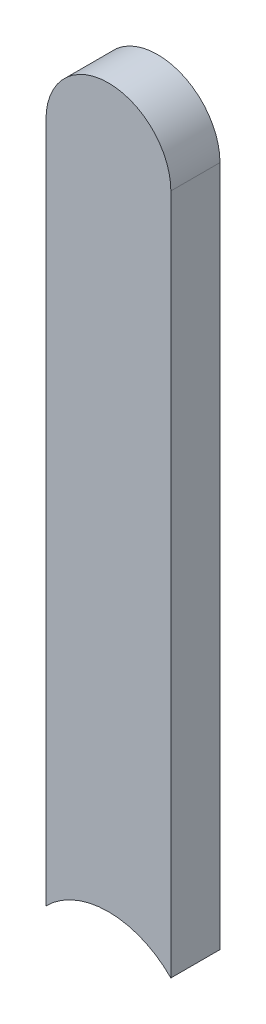
ISO-10303-21;
HEADER;
FILE_DESCRIPTION(('STEP AP214'),'2;1');
FILE_NAME('part.step','',(''),(''),'','','');
FILE_SCHEMA(('AUTOMOTIVE_DESIGN { 1 0 10303 214 1 1 1 1 }'));
ENDSEC;
DATA;
#1=APPLICATION_CONTEXT('core data for automotive mechanical design processes');
#2=APPLICATION_PROTOCOL_DEFINITION('international standard','automotive_design',2000,#1);
#3=PRODUCT_CONTEXT('',#1,'mechanical');
#4=PRODUCT('Part','Part','',(#3));
#5=PRODUCT_RELATED_PRODUCT_CATEGORY('part','',(#4));
#6=PRODUCT_DEFINITION_FORMATION('','',#4);
#7=PRODUCT_DEFINITION_CONTEXT('part definition',#1,'design');
#8=PRODUCT_DEFINITION('design','',#6,#7);
#9=PRODUCT_DEFINITION_SHAPE('','',#8);
#10=(LENGTH_UNIT() NAMED_UNIT(*) SI_UNIT(.MILLI.,.METRE.));
#11=(NAMED_UNIT(*) PLANE_ANGLE_UNIT() SI_UNIT($,.RADIAN.));
#12=(NAMED_UNIT(*) SI_UNIT($,.STERADIAN.) SOLID_ANGLE_UNIT());
#13=UNCERTAINTY_MEASURE_WITH_UNIT(LENGTH_MEASURE(1.E-05),#10,'distance_accuracy_value','');
#14=(GEOMETRIC_REPRESENTATION_CONTEXT(3) GLOBAL_UNCERTAINTY_ASSIGNED_CONTEXT((#13)) GLOBAL_UNIT_ASSIGNED_CONTEXT((#10,
#11,#12)) REPRESENTATION_CONTEXT('',''));
#15=CARTESIAN_POINT('',(0.,0.,0.));
#16=DIRECTION('',(0.,0.,1.));
#17=DIRECTION('',(1.,0.,0.));
#18=AXIS2_PLACEMENT_3D('',#15,#16,#17);
#19=CARTESIAN_POINT('',(123.8758,111.950803757867,0.));
#20=DIRECTION('',(-1.,0.,0.));
#21=DIRECTION('',(0.,1.,0.));
#22=AXIS2_PLACEMENT_3D('',#19,#20,#21);
#23=PLANE('',#22);
#24=DIRECTION('',(0.,1.,0.));
#25=VECTOR('',#24,1.);
#26=CARTESIAN_POINT('',(123.8758,111.7019356,0.1999996));
#27=LINE('',#26,#25);
#28=CARTESIAN_POINT('',(123.8758,111.950803757867,0.1999996));
#29=VERTEX_POINT('',#28);
#30=CARTESIAN_POINT('',(123.8758,114.724688,0.1999996));
#31=VERTEX_POINT('',#30);
#32=EDGE_CURVE('E11',#29,#31,#27,.T.);
#33=ORIENTED_EDGE('',*,*,#32,.F.);
#34=DIRECTION('',(0.,0.,1.));
#35=VECTOR('',#34,1.);
#36=CARTESIAN_POINT('',(123.8758,111.950803757867,0.));
#37=LINE('',#36,#35);
#38=CARTESIAN_POINT('',(123.8758,111.950803757867,0.));
#39=VERTEX_POINT('',#38);
#40=EDGE_CURVE('E24',#39,#29,#37,.T.);
#41=ORIENTED_EDGE('',*,*,#40,.F.);
#42=DIRECTION('',(0.,1.,0.));
#43=VECTOR('',#42,1.);
#44=CARTESIAN_POINT('',(123.8758,111.7019356,0.));
#45=LINE('',#44,#43);
#46=CARTESIAN_POINT('',(123.8758,114.724688,0.));
#47=VERTEX_POINT('',#46);
#48=EDGE_CURVE('E75',#39,#47,#45,.T.);
#49=ORIENTED_EDGE('',*,*,#48,.T.);
#50=DIRECTION('',(0.,0.,1.));
#51=VECTOR('',#50,1.);
#52=CARTESIAN_POINT('',(123.8758,114.724688,0.));
#53=LINE('',#52,#51);
#54=EDGE_CURVE('E37',#47,#31,#53,.T.);
#55=ORIENTED_EDGE('',*,*,#54,.T.);
#56=EDGE_LOOP('',(#33,#41,#49,#55));
#57=FACE_BOUND('',#56,.T.);
#58=ADVANCED_FACE('F17',(#57),#23,.F.);
#59=CARTESIAN_POINT('',(123.6218,114.724688,0.));
#60=DIRECTION('',(0.,0.,-1.));
#61=DIRECTION('',(1.,0.,0.));
#62=AXIS2_PLACEMENT_3D('',#59,#60,#61);
#63=CYLINDRICAL_SURFACE('',#62,0.253999999999995);
#64=CARTESIAN_POINT('',(123.6218,114.724688,0.1999996));
#65=DIRECTION('',(0.,0.,1.));
#66=DIRECTION('',(1.,0.,0.));
#67=AXIS2_PLACEMENT_3D('',#64,#65,#66);
#68=CIRCLE('',#67,0.253999999999995);
#69=CARTESIAN_POINT('',(123.3678,114.724688,0.1999996));
#70=VERTEX_POINT('',#69);
#71=EDGE_CURVE('E83',#31,#70,#68,.T.);
#72=ORIENTED_EDGE('',*,*,#71,.F.);
#73=ORIENTED_EDGE('',*,*,#54,.F.);
#74=CARTESIAN_POINT('',(123.6218,114.724688,0.));
#75=DIRECTION('',(0.,0.,1.));
#76=DIRECTION('',(1.,0.,0.));
#77=AXIS2_PLACEMENT_3D('',#74,#75,#76);
#78=CIRCLE('',#77,0.253999999999995);
#79=CARTESIAN_POINT('',(123.3678,114.724688,0.));
#80=VERTEX_POINT('',#79);
#81=EDGE_CURVE('E81',#47,#80,#78,.T.);
#82=ORIENTED_EDGE('',*,*,#81,.T.);
#83=DIRECTION('',(0.,0.,1.));
#84=VECTOR('',#83,1.);
#85=CARTESIAN_POINT('',(123.3678,114.724688,0.));
#86=LINE('',#85,#84);
#87=EDGE_CURVE('E67',#80,#70,#86,.T.);
#88=ORIENTED_EDGE('',*,*,#87,.T.);
#89=EDGE_LOOP('',(#72,#73,#82,#88));
#90=FACE_BOUND('',#89,.T.);
#91=ADVANCED_FACE('F89',(#90),#63,.T.);
#92=CARTESIAN_POINT('',(123.3678,114.724688,0.));
#93=DIRECTION('',(1.,0.,0.));
#94=DIRECTION('',(0.,-1.,0.));
#95=AXIS2_PLACEMENT_3D('',#92,#93,#94);
#96=PLANE('',#95);
#97=DIRECTION('',(0.,-1.,0.));
#98=VECTOR('',#97,1.);
#99=CARTESIAN_POINT('',(123.3678,114.724688,0.1999996));
#100=LINE('',#99,#98);
#101=CARTESIAN_POINT('',(123.3678,111.950803757867,0.1999996));
#102=VERTEX_POINT('',#101);
#103=EDGE_CURVE('E71',#70,#102,#100,.T.);
#104=ORIENTED_EDGE('',*,*,#103,.F.);
#105=ORIENTED_EDGE('',*,*,#87,.F.);
#106=DIRECTION('',(0.,-1.,0.));
#107=VECTOR('',#106,1.);
#108=CARTESIAN_POINT('',(123.3678,114.724688,0.));
#109=LINE('',#108,#107);
#110=CARTESIAN_POINT('',(123.3678,111.950803757867,0.));
#111=VERTEX_POINT('',#110);
#112=EDGE_CURVE('E63',#80,#111,#109,.T.);
#113=ORIENTED_EDGE('',*,*,#112,.T.);
#114=DIRECTION('',(0.,0.,1.));
#115=VECTOR('',#114,1.);
#116=CARTESIAN_POINT('',(123.3678,111.950803757867,0.));
#117=LINE('',#116,#115);
#118=EDGE_CURVE('E53',#111,#102,#117,.T.);
#119=ORIENTED_EDGE('',*,*,#118,.T.);
#120=EDGE_LOOP('',(#104,#105,#113,#119));
#121=FACE_BOUND('',#120,.T.);
#122=ADVANCED_FACE('F66',(#121),#96,.F.);
#123=CARTESIAN_POINT('',(123.6218,111.7019356,0.));
#124=DIRECTION('',(0.,0.,-1.));
#125=DIRECTION('',(1.,0.,0.));
#126=AXIS2_PLACEMENT_3D('',#123,#124,#125);
#127=CYLINDRICAL_SURFACE('',#126,0.3556);
#128=ORIENTED_EDGE('',*,*,#40,.T.);
#129=CARTESIAN_POINT('',(123.6218,111.7019356,0.1999996));
#130=DIRECTION('',(0.,0.,1.));
#131=DIRECTION('',(1.,0.,0.));
#132=AXIS2_PLACEMENT_3D('',#129,#130,#131);
#133=CIRCLE('',#132,0.3556);
#134=EDGE_CURVE('E59',#29,#102,#133,.T.);
#135=ORIENTED_EDGE('',*,*,#134,.T.);
#136=ORIENTED_EDGE('',*,*,#118,.F.);
#137=CARTESIAN_POINT('',(123.6218,111.7019356,0.));
#138=DIRECTION('',(0.,0.,1.));
#139=DIRECTION('',(1.,0.,0.));
#140=AXIS2_PLACEMENT_3D('',#137,#138,#139);
#141=CIRCLE('',#140,0.3556);
#142=EDGE_CURVE('E57',#39,#111,#141,.T.);
#143=ORIENTED_EDGE('',*,*,#142,.F.);
#144=EDGE_LOOP('',(#128,#135,#136,#143));
#145=FACE_BOUND('',#144,.T.);
#146=ADVANCED_FACE('F55',(#145),#127,.F.);
#147=CARTESIAN_POINT('',(123.8758,111.7019356,0.));
#148=DIRECTION('',(0.,0.,-1.));
#149=DIRECTION('',(-1.,0.,0.));
#150=AXIS2_PLACEMENT_3D('',#147,#148,#149);
#151=PLANE('',#150);
#152=ORIENTED_EDGE('',*,*,#48,.F.);
#153=ORIENTED_EDGE('',*,*,#142,.T.);
#154=ORIENTED_EDGE('',*,*,#112,.F.);
#155=ORIENTED_EDGE('',*,*,#81,.F.);
#156=EDGE_LOOP('',(#152,#153,#154,#155));
#157=FACE_BOUND('',#156,.T.);
#158=ADVANCED_FACE('F74',(#157),#151,.T.);
#159=CARTESIAN_POINT('',(123.8758,111.7019356,0.1999996));
#160=DIRECTION('',(0.,0.,-1.));
#161=DIRECTION('',(-1.,0.,0.));
#162=AXIS2_PLACEMENT_3D('',#159,#160,#161);
#163=PLANE('',#162);
#164=ORIENTED_EDGE('',*,*,#134,.F.);
#165=ORIENTED_EDGE('',*,*,#32,.T.);
#166=ORIENTED_EDGE('',*,*,#71,.T.);
#167=ORIENTED_EDGE('',*,*,#103,.T.);
#168=EDGE_LOOP('',(#164,#165,#166,#167));
#169=FACE_BOUND('',#168,.T.);
#170=ADVANCED_FACE('F91',(#169),#163,.F.);
#171=CLOSED_SHELL('',(#58,#91,#122,#146,#158,#170));
#172=MANIFOLD_SOLID_BREP('B1',#171);
#173=ADVANCED_BREP_SHAPE_REPRESENTATION('',(#18,#172),#14);
#174=SHAPE_DEFINITION_REPRESENTATION(#9,#173);
ENDSEC;
END-ISO-10303-21;
